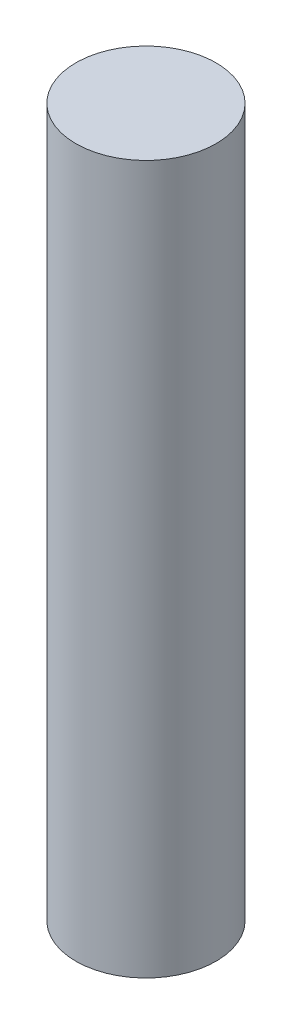
ISO-10303-21;
HEADER;
FILE_DESCRIPTION(('STEP AP214'),'2;1');
FILE_NAME('part.step','',(''),(''),'','','');
FILE_SCHEMA(('AUTOMOTIVE_DESIGN { 1 0 10303 214 1 1 1 1 }'));
ENDSEC;
DATA;
#1=APPLICATION_CONTEXT('core data for automotive mechanical design processes');
#2=APPLICATION_PROTOCOL_DEFINITION('international standard','automotive_design',2000,#1);
#3=PRODUCT_CONTEXT('',#1,'mechanical');
#4=PRODUCT('Part','Part','',(#3));
#5=PRODUCT_RELATED_PRODUCT_CATEGORY('part','',(#4));
#6=PRODUCT_DEFINITION_FORMATION('','',#4);
#7=PRODUCT_DEFINITION_CONTEXT('part definition',#1,'design');
#8=PRODUCT_DEFINITION('design','',#6,#7);
#9=PRODUCT_DEFINITION_SHAPE('','',#8);
#10=(LENGTH_UNIT() NAMED_UNIT(*) SI_UNIT(.MILLI.,.METRE.));
#11=(NAMED_UNIT(*) PLANE_ANGLE_UNIT() SI_UNIT($,.RADIAN.));
#12=(NAMED_UNIT(*) SI_UNIT($,.STERADIAN.) SOLID_ANGLE_UNIT());
#13=UNCERTAINTY_MEASURE_WITH_UNIT(LENGTH_MEASURE(1.E-05),#10,'distance_accuracy_value','');
#14=(GEOMETRIC_REPRESENTATION_CONTEXT(3) GLOBAL_UNCERTAINTY_ASSIGNED_CONTEXT((#13)) GLOBAL_UNIT_ASSIGNED_CONTEXT((#10,
#11,#12)) REPRESENTATION_CONTEXT('',''));
#15=CARTESIAN_POINT('',(0.,0.,0.));
#16=DIRECTION('',(0.,0.,1.));
#17=DIRECTION('',(1.,0.,0.));
#18=AXIS2_PLACEMENT_3D('',#15,#16,#17);
#19=CARTESIAN_POINT('',(0.,50.,0.));
#20=DIRECTION('',(0.,-1.,0.));
#21=DIRECTION('',(0.,0.,-1.));
#22=AXIS2_PLACEMENT_3D('',#19,#20,#21);
#23=CYLINDRICAL_SURFACE('',#22,4.95);
#24=CARTESIAN_POINT('',(0.,50.,0.));
#25=DIRECTION('',(0.,1.,0.));
#26=DIRECTION('',(0.,0.,1.));
#27=AXIS2_PLACEMENT_3D('',#24,#25,#26);
#28=CIRCLE('',#27,4.95);
#29=CARTESIAN_POINT('',(0.,50.,4.95));
#30=VERTEX_POINT('',#29);
#31=EDGE_CURVE('E10',#30,#30,#28,.T.);
#32=ORIENTED_EDGE('',*,*,#31,.F.);
#33=EDGE_LOOP('',(#32));
#34=FACE_BOUND('',#33,.T.);
#35=CARTESIAN_POINT('',(0.,0.,0.));
#36=DIRECTION('',(0.,1.,0.));
#37=DIRECTION('',(0.,0.,1.));
#38=AXIS2_PLACEMENT_3D('',#35,#36,#37);
#39=CIRCLE('',#38,4.95);
#40=CARTESIAN_POINT('',(0.,0.,4.95));
#41=VERTEX_POINT('',#40);
#42=EDGE_CURVE('E42',#41,#41,#39,.T.);
#43=ORIENTED_EDGE('',*,*,#42,.T.);
#44=EDGE_LOOP('',(#43));
#45=FACE_BOUND('',#44,.T.);
#46=ADVANCED_FACE('F39',(#34,#45),#23,.T.);
#47=CARTESIAN_POINT('',(0.,50.,0.));
#48=DIRECTION('',(0.,1.,0.));
#49=DIRECTION('',(0.,0.,1.));
#50=AXIS2_PLACEMENT_3D('',#47,#48,#49);
#51=PLANE('',#50);
#52=ORIENTED_EDGE('',*,*,#31,.T.);
#53=EDGE_LOOP('',(#52));
#54=FACE_BOUND('',#53,.T.);
#55=ADVANCED_FACE('F54',(#54),#51,.T.);
#56=CARTESIAN_POINT('',(0.,0.,0.));
#57=DIRECTION('',(0.,1.,0.));
#58=DIRECTION('',(0.,0.,1.));
#59=AXIS2_PLACEMENT_3D('',#56,#57,#58);
#60=PLANE('',#59);
#61=ORIENTED_EDGE('',*,*,#42,.F.);
#62=EDGE_LOOP('',(#61));
#63=FACE_BOUND('',#62,.T.);
#64=ADVANCED_FACE('F52',(#63),#60,.F.);
#65=CLOSED_SHELL('',(#46,#55,#64));
#66=MANIFOLD_SOLID_BREP('B2',#65);
#67=ADVANCED_BREP_SHAPE_REPRESENTATION('',(#18,#66),#14);
#68=SHAPE_DEFINITION_REPRESENTATION(#9,#67);
ENDSEC;
END-ISO-10303-21;
